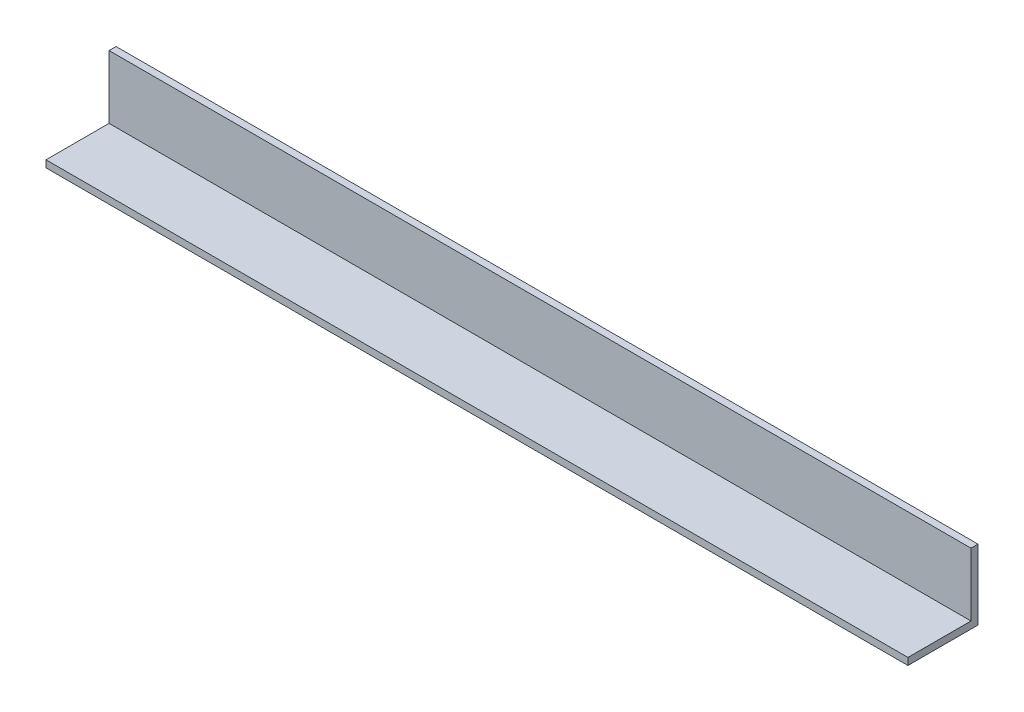
ISO-10303-21;
HEADER;
FILE_DESCRIPTION(('STEP AP214'),'2;1');
FILE_NAME('part.step','',(''),(''),'','','');
FILE_SCHEMA(('AUTOMOTIVE_DESIGN { 1 0 10303 214 1 1 1 1 }'));
ENDSEC;
DATA;
#1=APPLICATION_CONTEXT('core data for automotive mechanical design processes');
#2=APPLICATION_PROTOCOL_DEFINITION('international standard','automotive_design',2000,#1);
#3=PRODUCT_CONTEXT('',#1,'mechanical');
#4=PRODUCT('Part','Part','',(#3));
#5=PRODUCT_RELATED_PRODUCT_CATEGORY('part','',(#4));
#6=PRODUCT_DEFINITION_FORMATION('','',#4);
#7=PRODUCT_DEFINITION_CONTEXT('part definition',#1,'design');
#8=PRODUCT_DEFINITION('design','',#6,#7);
#9=PRODUCT_DEFINITION_SHAPE('','',#8);
#10=(LENGTH_UNIT() NAMED_UNIT(*) SI_UNIT(.MILLI.,.METRE.));
#11=(NAMED_UNIT(*) PLANE_ANGLE_UNIT() SI_UNIT($,.RADIAN.));
#12=(NAMED_UNIT(*) SI_UNIT($,.STERADIAN.) SOLID_ANGLE_UNIT());
#13=UNCERTAINTY_MEASURE_WITH_UNIT(LENGTH_MEASURE(1.E-05),#10,'distance_accuracy_value','');
#14=(GEOMETRIC_REPRESENTATION_CONTEXT(3) GLOBAL_UNCERTAINTY_ASSIGNED_CONTEXT((#13)) GLOBAL_UNIT_ASSIGNED_CONTEXT((#10,
#11,#12)) REPRESENTATION_CONTEXT('',''));
#15=CARTESIAN_POINT('',(0.,0.,0.));
#16=DIRECTION('',(0.,0.,1.));
#17=DIRECTION('',(1.,0.,0.));
#18=AXIS2_PLACEMENT_3D('',#15,#16,#17);
#19=CARTESIAN_POINT('',(246.,20.,2.));
#20=DIRECTION('',(0.,-1.,0.));
#21=DIRECTION('',(0.,0.,-1.));
#22=AXIS2_PLACEMENT_3D('',#19,#20,#21);
#23=PLANE('',#22);
#24=DIRECTION('',(0.,0.,1.));
#25=VECTOR('',#24,1.);
#26=CARTESIAN_POINT('',(0.,20.,2.));
#27=LINE('',#26,#25);
#28=CARTESIAN_POINT('',(0.,20.,0.));
#29=VERTEX_POINT('',#28);
#30=CARTESIAN_POINT('',(0.,20.,2.));
#31=VERTEX_POINT('',#30);
#32=EDGE_CURVE('E123',#29,#31,#27,.T.);
#33=ORIENTED_EDGE('',*,*,#32,.T.);
#34=DIRECTION('',(-1.,0.,0.));
#35=VECTOR('',#34,1.);
#36=CARTESIAN_POINT('',(246.,20.,2.));
#37=LINE('',#36,#35);
#38=CARTESIAN_POINT('',(246.,20.,2.));
#39=VERTEX_POINT('',#38);
#40=EDGE_CURVE('E11',#39,#31,#37,.T.);
#41=ORIENTED_EDGE('',*,*,#40,.F.);
#42=DIRECTION('',(0.,0.,1.));
#43=VECTOR('',#42,1.);
#44=CARTESIAN_POINT('',(246.,20.,2.));
#45=LINE('',#44,#43);
#46=CARTESIAN_POINT('',(246.,20.,0.));
#47=VERTEX_POINT('',#46);
#48=EDGE_CURVE('E133',#47,#39,#45,.T.);
#49=ORIENTED_EDGE('',*,*,#48,.F.);
#50=DIRECTION('',(-1.,0.,0.));
#51=VECTOR('',#50,1.);
#52=CARTESIAN_POINT('',(246.,20.,0.));
#53=LINE('',#52,#51);
#54=EDGE_CURVE('E119',#47,#29,#53,.T.);
#55=ORIENTED_EDGE('',*,*,#54,.T.);
#56=EDGE_LOOP('',(#33,#41,#49,#55));
#57=FACE_BOUND('',#56,.T.);
#58=ADVANCED_FACE('F39',(#57),#23,.F.);
#59=CARTESIAN_POINT('',(246.,2.,2.));
#60=DIRECTION('',(0.,0.,-1.));
#61=DIRECTION('',(0.,1.,0.));
#62=AXIS2_PLACEMENT_3D('',#59,#60,#61);
#63=PLANE('',#62);
#64=DIRECTION('',(0.,-1.,0.));
#65=VECTOR('',#64,1.);
#66=CARTESIAN_POINT('',(0.,2.,2.));
#67=LINE('',#66,#65);
#68=CARTESIAN_POINT('',(0.,2.,2.));
#69=VERTEX_POINT('',#68);
#70=EDGE_CURVE('E126',#31,#69,#67,.T.);
#71=ORIENTED_EDGE('',*,*,#70,.T.);
#72=DIRECTION('',(-1.,0.,0.));
#73=VECTOR('',#72,1.);
#74=CARTESIAN_POINT('',(246.,2.,2.));
#75=LINE('',#74,#73);
#76=CARTESIAN_POINT('',(246.,2.,2.));
#77=VERTEX_POINT('',#76);
#78=EDGE_CURVE('E47',#77,#69,#75,.T.);
#79=ORIENTED_EDGE('',*,*,#78,.F.);
#80=DIRECTION('',(0.,-1.,0.));
#81=VECTOR('',#80,1.);
#82=CARTESIAN_POINT('',(246.,2.,2.));
#83=LINE('',#82,#81);
#84=EDGE_CURVE('E92',#39,#77,#83,.T.);
#85=ORIENTED_EDGE('',*,*,#84,.F.);
#86=ORIENTED_EDGE('',*,*,#40,.T.);
#87=EDGE_LOOP('',(#71,#79,#85,#86));
#88=FACE_BOUND('',#87,.T.);
#89=ADVANCED_FACE('F157',(#88),#63,.F.);
#90=CARTESIAN_POINT('',(246.,2.,20.));
#91=DIRECTION('',(0.,-1.,0.));
#92=DIRECTION('',(0.,0.,-1.));
#93=AXIS2_PLACEMENT_3D('',#90,#91,#92);
#94=PLANE('',#93);
#95=DIRECTION('',(0.,0.,1.));
#96=VECTOR('',#95,1.);
#97=CARTESIAN_POINT('',(0.,2.,20.));
#98=LINE('',#97,#96);
#99=CARTESIAN_POINT('',(0.,2.,20.));
#100=VERTEX_POINT('',#99);
#101=EDGE_CURVE('E128',#69,#100,#98,.T.);
#102=ORIENTED_EDGE('',*,*,#101,.T.);
#103=DIRECTION('',(-1.,0.,0.));
#104=VECTOR('',#103,1.);
#105=CARTESIAN_POINT('',(246.,2.,20.));
#106=LINE('',#105,#104);
#107=CARTESIAN_POINT('',(246.,2.,20.));
#108=VERTEX_POINT('',#107);
#109=EDGE_CURVE('E114',#108,#100,#106,.T.);
#110=ORIENTED_EDGE('',*,*,#109,.F.);
#111=DIRECTION('',(0.,0.,1.));
#112=VECTOR('',#111,1.);
#113=CARTESIAN_POINT('',(246.,2.,20.));
#114=LINE('',#113,#112);
#115=EDGE_CURVE('E105',#77,#108,#114,.T.);
#116=ORIENTED_EDGE('',*,*,#115,.F.);
#117=ORIENTED_EDGE('',*,*,#78,.T.);
#118=EDGE_LOOP('',(#102,#110,#116,#117));
#119=FACE_BOUND('',#118,.T.);
#120=ADVANCED_FACE('F139',(#119),#94,.F.);
#121=CARTESIAN_POINT('',(246.,0.,20.));
#122=DIRECTION('',(0.,0.,-1.));
#123=DIRECTION('',(-1.,0.,0.));
#124=AXIS2_PLACEMENT_3D('',#121,#122,#123);
#125=PLANE('',#124);
#126=DIRECTION('',(0.,-1.,0.));
#127=VECTOR('',#126,1.);
#128=CARTESIAN_POINT('',(0.,0.,20.));
#129=LINE('',#128,#127);
#130=CARTESIAN_POINT('',(0.,0.,20.));
#131=VERTEX_POINT('',#130);
#132=EDGE_CURVE('E113',#100,#131,#129,.T.);
#133=ORIENTED_EDGE('',*,*,#132,.T.);
#134=DIRECTION('',(-1.,0.,0.));
#135=VECTOR('',#134,1.);
#136=CARTESIAN_POINT('',(246.,0.,20.));
#137=LINE('',#136,#135);
#138=CARTESIAN_POINT('',(246.,0.,20.));
#139=VERTEX_POINT('',#138);
#140=EDGE_CURVE('E110',#139,#131,#137,.T.);
#141=ORIENTED_EDGE('',*,*,#140,.F.);
#142=DIRECTION('',(0.,-1.,0.));
#143=VECTOR('',#142,1.);
#144=CARTESIAN_POINT('',(246.,0.,20.));
#145=LINE('',#144,#143);
#146=EDGE_CURVE('E99',#108,#139,#145,.T.);
#147=ORIENTED_EDGE('',*,*,#146,.F.);
#148=ORIENTED_EDGE('',*,*,#109,.T.);
#149=EDGE_LOOP('',(#133,#141,#147,#148));
#150=FACE_BOUND('',#149,.T.);
#151=ADVANCED_FACE('F111',(#150),#125,.F.);
#152=CARTESIAN_POINT('',(246.,0.,0.));
#153=DIRECTION('',(0.,1.,0.));
#154=DIRECTION('',(0.,0.,1.));
#155=AXIS2_PLACEMENT_3D('',#152,#153,#154);
#156=PLANE('',#155);
#157=DIRECTION('',(0.,0.,-1.));
#158=VECTOR('',#157,1.);
#159=CARTESIAN_POINT('',(0.,0.,0.));
#160=LINE('',#159,#158);
#161=CARTESIAN_POINT('',(0.,0.,0.));
#162=VERTEX_POINT('',#161);
#163=EDGE_CURVE('E78',#131,#162,#160,.T.);
#164=ORIENTED_EDGE('',*,*,#163,.T.);
#165=DIRECTION('',(-1.,0.,0.));
#166=VECTOR('',#165,1.);
#167=CARTESIAN_POINT('',(246.,0.,0.));
#168=LINE('',#167,#166);
#169=CARTESIAN_POINT('',(246.,0.,0.));
#170=VERTEX_POINT('',#169);
#171=EDGE_CURVE('E115',#170,#162,#168,.T.);
#172=ORIENTED_EDGE('',*,*,#171,.F.);
#173=DIRECTION('',(0.,0.,-1.));
#174=VECTOR('',#173,1.);
#175=CARTESIAN_POINT('',(246.,0.,0.));
#176=LINE('',#175,#174);
#177=EDGE_CURVE('E103',#139,#170,#176,.T.);
#178=ORIENTED_EDGE('',*,*,#177,.F.);
#179=ORIENTED_EDGE('',*,*,#140,.T.);
#180=EDGE_LOOP('',(#164,#172,#178,#179));
#181=FACE_BOUND('',#180,.T.);
#182=ADVANCED_FACE('F117',(#181),#156,.F.);
#183=CARTESIAN_POINT('',(246.,20.,0.));
#184=DIRECTION('',(0.,0.,1.));
#185=DIRECTION('',(1.,0.,0.));
#186=AXIS2_PLACEMENT_3D('',#183,#184,#185);
#187=PLANE('',#186);
#188=DIRECTION('',(0.,1.,0.));
#189=VECTOR('',#188,1.);
#190=CARTESIAN_POINT('',(0.,20.,0.));
#191=LINE('',#190,#189);
#192=EDGE_CURVE('E84',#162,#29,#191,.T.);
#193=ORIENTED_EDGE('',*,*,#192,.T.);
#194=ORIENTED_EDGE('',*,*,#54,.F.);
#195=DIRECTION('',(0.,1.,0.));
#196=VECTOR('',#195,1.);
#197=CARTESIAN_POINT('',(246.,20.,0.));
#198=LINE('',#197,#196);
#199=EDGE_CURVE('E55',#170,#47,#198,.T.);
#200=ORIENTED_EDGE('',*,*,#199,.F.);
#201=ORIENTED_EDGE('',*,*,#171,.T.);
#202=EDGE_LOOP('',(#193,#194,#200,#201));
#203=FACE_BOUND('',#202,.T.);
#204=ADVANCED_FACE('F146',(#203),#187,.F.);
#205=CARTESIAN_POINT('',(246.,0.,0.));
#206=DIRECTION('',(-1.,0.,0.));
#207=DIRECTION('',(0.,0.,1.));
#208=AXIS2_PLACEMENT_3D('',#205,#206,#207);
#209=PLANE('',#208);
#210=ORIENTED_EDGE('',*,*,#48,.T.);
#211=ORIENTED_EDGE('',*,*,#84,.T.);
#212=ORIENTED_EDGE('',*,*,#115,.T.);
#213=ORIENTED_EDGE('',*,*,#146,.T.);
#214=ORIENTED_EDGE('',*,*,#177,.T.);
#215=ORIENTED_EDGE('',*,*,#199,.T.);
#216=EDGE_LOOP('',(#210,#211,#212,#213,#214,#215));
#217=FACE_BOUND('',#216,.T.);
#218=ADVANCED_FACE('F101',(#217),#209,.F.);
#219=CARTESIAN_POINT('',(0.,0.,0.));
#220=DIRECTION('',(-1.,0.,0.));
#221=DIRECTION('',(0.,0.,1.));
#222=AXIS2_PLACEMENT_3D('',#219,#220,#221);
#223=PLANE('',#222);
#224=ORIENTED_EDGE('',*,*,#32,.F.);
#225=ORIENTED_EDGE('',*,*,#192,.F.);
#226=ORIENTED_EDGE('',*,*,#163,.F.);
#227=ORIENTED_EDGE('',*,*,#132,.F.);
#228=ORIENTED_EDGE('',*,*,#101,.F.);
#229=ORIENTED_EDGE('',*,*,#70,.F.);
#230=EDGE_LOOP('',(#224,#225,#226,#227,#228,#229));
#231=FACE_BOUND('',#230,.T.);
#232=ADVANCED_FACE('F142',(#231),#223,.T.);
#233=CLOSED_SHELL('',(#58,#89,#120,#151,#182,#204,#218,#232));
#234=MANIFOLD_SOLID_BREP('B2',#233);
#235=ADVANCED_BREP_SHAPE_REPRESENTATION('',(#18,#234),#14);
#236=SHAPE_DEFINITION_REPRESENTATION(#9,#235);
ENDSEC;
END-ISO-10303-21;
